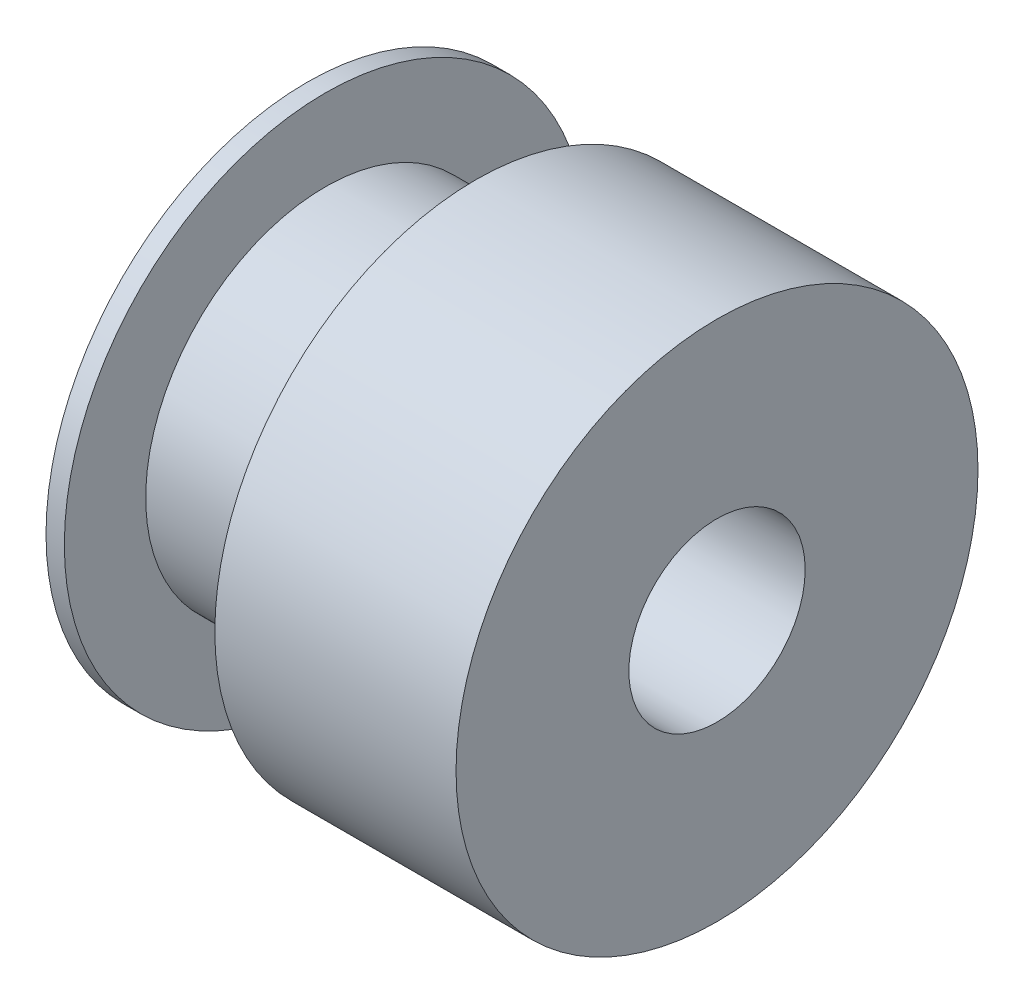
ISO-10303-21;
HEADER;
FILE_DESCRIPTION(('STEP AP214'),'2;1');
FILE_NAME('part.step','',(''),(''),'','','');
FILE_SCHEMA(('AUTOMOTIVE_DESIGN { 1 0 10303 214 1 1 1 1 }'));
ENDSEC;
DATA;
#1=APPLICATION_CONTEXT('core data for automotive mechanical design processes');
#2=APPLICATION_PROTOCOL_DEFINITION('international standard','automotive_design',2000,#1);
#3=PRODUCT_CONTEXT('',#1,'mechanical');
#4=PRODUCT('Part','Part','',(#3));
#5=PRODUCT_RELATED_PRODUCT_CATEGORY('part','',(#4));
#6=PRODUCT_DEFINITION_FORMATION('','',#4);
#7=PRODUCT_DEFINITION_CONTEXT('part definition',#1,'design');
#8=PRODUCT_DEFINITION('design','',#6,#7);
#9=PRODUCT_DEFINITION_SHAPE('','',#8);
#10=(LENGTH_UNIT() NAMED_UNIT(*) SI_UNIT(.MILLI.,.METRE.));
#11=(NAMED_UNIT(*) PLANE_ANGLE_UNIT() SI_UNIT($,.RADIAN.));
#12=(NAMED_UNIT(*) SI_UNIT($,.STERADIAN.) SOLID_ANGLE_UNIT());
#13=UNCERTAINTY_MEASURE_WITH_UNIT(LENGTH_MEASURE(1.E-05),#10,'distance_accuracy_value','');
#14=(GEOMETRIC_REPRESENTATION_CONTEXT(3) GLOBAL_UNCERTAINTY_ASSIGNED_CONTEXT((#13)) GLOBAL_UNIT_ASSIGNED_CONTEXT((#10,
#11,#12)) REPRESENTATION_CONTEXT('',''));
#15=CARTESIAN_POINT('',(0.,0.,0.));
#16=DIRECTION('',(0.,0.,1.));
#17=DIRECTION('',(1.,0.,0.));
#18=AXIS2_PLACEMENT_3D('',#15,#16,#17);
#19=CARTESIAN_POINT('',(0.4953,0.,0.));
#20=DIRECTION('',(1.,0.,0.));
#21=DIRECTION('',(0.,0.,-1.));
#22=AXIS2_PLACEMENT_3D('',#19,#20,#21);
#23=PLANE('',#22);
#24=CARTESIAN_POINT('',(0.4953,0.,0.));
#25=DIRECTION('',(1.,0.,0.));
#26=DIRECTION('',(0.,0.,-1.));
#27=AXIS2_PLACEMENT_3D('',#24,#25,#26);
#28=CIRCLE('',#27,7.0485);
#29=CARTESIAN_POINT('',(0.4953,0.,-7.0485));
#30=VERTEX_POINT('',#29);
#31=EDGE_CURVE('E10',#30,#30,#28,.T.);
#32=ORIENTED_EDGE('',*,*,#31,.T.);
#33=EDGE_LOOP('',(#32));
#34=FACE_BOUND('',#33,.T.);
#35=CARTESIAN_POINT('',(0.4953,0.,0.));
#36=DIRECTION('',(1.,0.,0.));
#37=DIRECTION('',(0.,0.,-1.));
#38=AXIS2_PLACEMENT_3D('',#35,#36,#37);
#39=CIRCLE('',#38,4.8514);
#40=CARTESIAN_POINT('',(0.4953,0.,-4.8514));
#41=VERTEX_POINT('',#40);
#42=EDGE_CURVE('E44',#41,#41,#39,.T.);
#43=ORIENTED_EDGE('',*,*,#42,.F.);
#44=EDGE_LOOP('',(#43));
#45=FACE_BOUND('',#44,.T.);
#46=ADVANCED_FACE('F31',(#34,#45),#23,.T.);
#47=CARTESIAN_POINT('',(0.4953,0.,0.));
#48=DIRECTION('',(-1.,0.,0.));
#49=DIRECTION('',(0.,0.,1.));
#50=AXIS2_PLACEMENT_3D('',#47,#48,#49);
#51=CYLINDRICAL_SURFACE('',#50,7.0485);
#52=ORIENTED_EDGE('',*,*,#31,.F.);
#53=EDGE_LOOP('',(#52));
#54=FACE_BOUND('',#53,.T.);
#55=CARTESIAN_POINT('',(0.,0.,0.));
#56=DIRECTION('',(1.,0.,0.));
#57=DIRECTION('',(0.,0.,-1.));
#58=AXIS2_PLACEMENT_3D('',#55,#56,#57);
#59=CIRCLE('',#58,7.0485);
#60=CARTESIAN_POINT('',(0.,0.,-7.0485));
#61=VERTEX_POINT('',#60);
#62=EDGE_CURVE('E35',#61,#61,#59,.T.);
#63=ORIENTED_EDGE('',*,*,#62,.T.);
#64=EDGE_LOOP('',(#63));
#65=FACE_BOUND('',#64,.T.);
#66=ADVANCED_FACE('F33',(#54,#65),#51,.T.);
#67=CARTESIAN_POINT('',(0.,0.,0.));
#68=DIRECTION('',(1.,0.,0.));
#69=DIRECTION('',(0.,0.,-1.));
#70=AXIS2_PLACEMENT_3D('',#67,#68,#69);
#71=PLANE('',#70);
#72=CARTESIAN_POINT('',(0.,0.,0.));
#73=DIRECTION('',(1.,0.,0.));
#74=DIRECTION('',(0.,0.,-1.));
#75=AXIS2_PLACEMENT_3D('',#72,#73,#74);
#76=CIRCLE('',#75,2.38125);
#77=CARTESIAN_POINT('',(0.,0.,-2.38125));
#78=VERTEX_POINT('',#77);
#79=EDGE_CURVE('E55',#78,#78,#76,.T.);
#80=ORIENTED_EDGE('',*,*,#79,.T.);
#81=EDGE_LOOP('',(#80));
#82=FACE_BOUND('',#81,.T.);
#83=ORIENTED_EDGE('',*,*,#62,.F.);
#84=EDGE_LOOP('',(#83));
#85=FACE_BOUND('',#84,.T.);
#86=ADVANCED_FACE('F62',(#82,#85),#71,.F.);
#87=CARTESIAN_POINT('',(4.5593,0.,0.));
#88=DIRECTION('',(-1.,0.,0.));
#89=DIRECTION('',(0.,0.,1.));
#90=AXIS2_PLACEMENT_3D('',#87,#88,#89);
#91=CYLINDRICAL_SURFACE('',#90,4.8514);
#92=CARTESIAN_POINT('',(4.5593,0.,0.));
#93=DIRECTION('',(1.,0.,0.));
#94=DIRECTION('',(0.,0.,-1.));
#95=AXIS2_PLACEMENT_3D('',#92,#93,#94);
#96=CIRCLE('',#95,4.8514);
#97=CARTESIAN_POINT('',(4.5593,0.,-4.8514));
#98=VERTEX_POINT('',#97);
#99=EDGE_CURVE('E42',#98,#98,#96,.T.);
#100=ORIENTED_EDGE('',*,*,#99,.F.);
#101=EDGE_LOOP('',(#100));
#102=FACE_BOUND('',#101,.T.);
#103=ORIENTED_EDGE('',*,*,#42,.T.);
#104=EDGE_LOOP('',(#103));
#105=FACE_BOUND('',#104,.T.);
#106=ADVANCED_FACE('F86',(#102,#105),#91,.T.);
#107=CARTESIAN_POINT('',(4.5593,0.,0.));
#108=DIRECTION('',(1.,0.,0.));
#109=DIRECTION('',(0.,0.,-1.));
#110=AXIS2_PLACEMENT_3D('',#107,#108,#109);
#111=PLANE('',#110);
#112=CARTESIAN_POINT('',(4.5593,0.,0.));
#113=DIRECTION('',(1.,0.,0.));
#114=DIRECTION('',(0.,0.,-1.));
#115=AXIS2_PLACEMENT_3D('',#112,#113,#114);
#116=CIRCLE('',#115,7.0485);
#117=CARTESIAN_POINT('',(4.5593,0.,-7.0485));
#118=VERTEX_POINT('',#117);
#119=EDGE_CURVE('E47',#118,#118,#116,.T.);
#120=ORIENTED_EDGE('',*,*,#119,.F.);
#121=EDGE_LOOP('',(#120));
#122=FACE_BOUND('',#121,.T.);
#123=ORIENTED_EDGE('',*,*,#99,.T.);
#124=EDGE_LOOP('',(#123));
#125=FACE_BOUND('',#124,.T.);
#126=ADVANCED_FACE('F79',(#122,#125),#111,.F.);
#127=CARTESIAN_POINT('',(5.0546,0.,0.));
#128=DIRECTION('',(-1.,0.,0.));
#129=DIRECTION('',(0.,0.,1.));
#130=AXIS2_PLACEMENT_3D('',#127,#128,#129);
#131=CYLINDRICAL_SURFACE('',#130,7.0485);
#132=ORIENTED_EDGE('',*,*,#119,.T.);
#133=EDGE_LOOP('',(#132));
#134=FACE_BOUND('',#133,.T.);
#135=CARTESIAN_POINT('',(11.0744,0.,0.));
#136=DIRECTION('',(1.,0.,0.));
#137=DIRECTION('',(0.,0.,-1.));
#138=AXIS2_PLACEMENT_3D('',#135,#136,#137);
#139=CIRCLE('',#138,7.0485);
#140=CARTESIAN_POINT('',(11.0744,0.,-7.0485));
#141=VERTEX_POINT('',#140);
#142=EDGE_CURVE('E52',#141,#141,#139,.T.);
#143=ORIENTED_EDGE('',*,*,#142,.F.);
#144=EDGE_LOOP('',(#143));
#145=FACE_BOUND('',#144,.T.);
#146=ADVANCED_FACE('F74',(#134,#145),#131,.T.);
#147=CARTESIAN_POINT('',(11.0744,0.,0.));
#148=DIRECTION('',(1.,0.,0.));
#149=DIRECTION('',(0.,0.,-1.));
#150=AXIS2_PLACEMENT_3D('',#147,#148,#149);
#151=PLANE('',#150);
#152=CARTESIAN_POINT('',(11.0744,0.,0.));
#153=DIRECTION('',(1.,0.,0.));
#154=DIRECTION('',(0.,0.,-1.));
#155=AXIS2_PLACEMENT_3D('',#152,#153,#154);
#156=CIRCLE('',#155,2.38125);
#157=CARTESIAN_POINT('',(11.0744,0.,-2.38125));
#158=VERTEX_POINT('',#157);
#159=EDGE_CURVE('E56',#158,#158,#156,.T.);
#160=ORIENTED_EDGE('',*,*,#159,.F.);
#161=EDGE_LOOP('',(#160));
#162=FACE_BOUND('',#161,.T.);
#163=ORIENTED_EDGE('',*,*,#142,.T.);
#164=EDGE_LOOP('',(#163));
#165=FACE_BOUND('',#164,.T.);
#166=ADVANCED_FACE('F68',(#162,#165),#151,.T.);
#167=CARTESIAN_POINT('',(0.,0.,0.));
#168=DIRECTION('',(1.,0.,0.));
#169=DIRECTION('',(0.,0.,-1.));
#170=AXIS2_PLACEMENT_3D('',#167,#168,#169);
#171=CYLINDRICAL_SURFACE('',#170,2.38125);
#172=ORIENTED_EDGE('',*,*,#79,.F.);
#173=EDGE_LOOP('',(#172));
#174=FACE_BOUND('',#173,.T.);
#175=ORIENTED_EDGE('',*,*,#159,.T.);
#176=EDGE_LOOP('',(#175));
#177=FACE_BOUND('',#176,.T.);
#178=ADVANCED_FACE('F65',(#174,#177),#171,.F.);
#179=CLOSED_SHELL('',(#46,#66,#86,#106,#126,#146,#166,#178));
#180=MANIFOLD_SOLID_BREP('B2',#179);
#181=ADVANCED_BREP_SHAPE_REPRESENTATION('',(#18,#180),#14);
#182=SHAPE_DEFINITION_REPRESENTATION(#9,#181);
ENDSEC;
END-ISO-10303-21;
